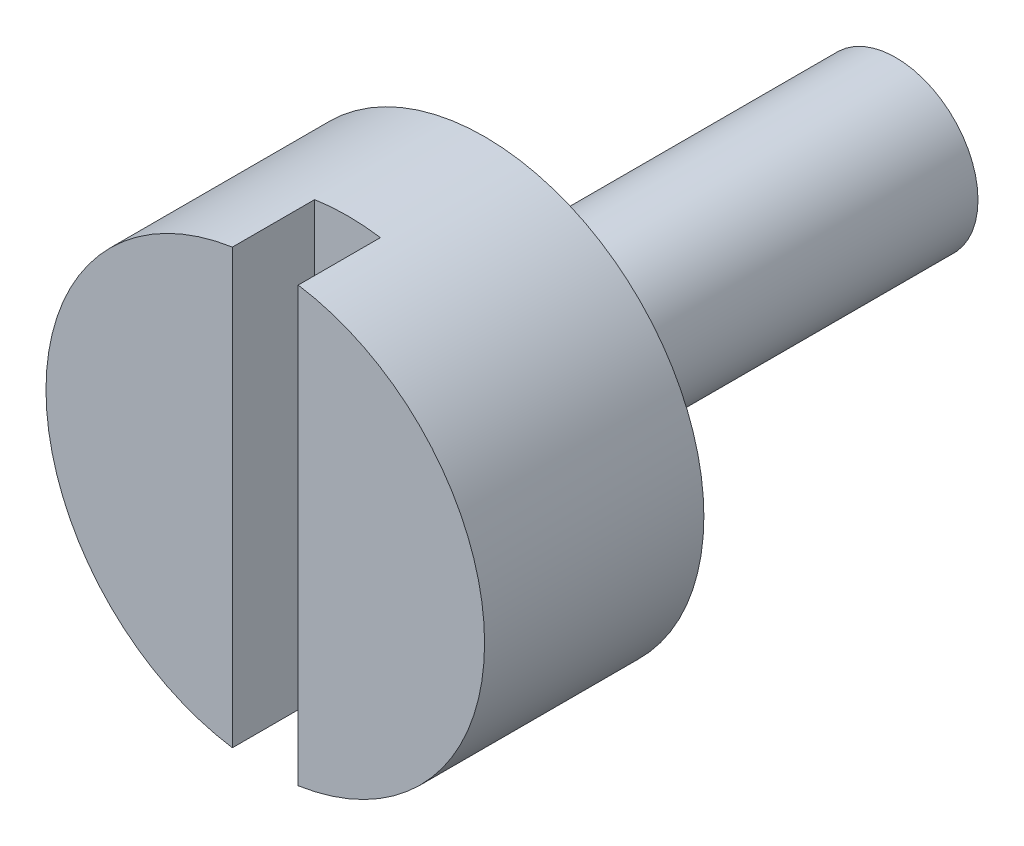
ISO-10303-21;
HEADER;
FILE_DESCRIPTION(('STEP AP214'),'2;1');
FILE_NAME('part.step','',(''),(''),'','','');
FILE_SCHEMA(('AUTOMOTIVE_DESIGN { 1 0 10303 214 1 1 1 1 }'));
ENDSEC;
DATA;
#1=APPLICATION_CONTEXT('core data for automotive mechanical design processes');
#2=APPLICATION_PROTOCOL_DEFINITION('international standard','automotive_design',2000,#1);
#3=PRODUCT_CONTEXT('',#1,'mechanical');
#4=PRODUCT('Part','Part','',(#3));
#5=PRODUCT_RELATED_PRODUCT_CATEGORY('part','',(#4));
#6=PRODUCT_DEFINITION_FORMATION('','',#4);
#7=PRODUCT_DEFINITION_CONTEXT('part definition',#1,'design');
#8=PRODUCT_DEFINITION('design','',#6,#7);
#9=PRODUCT_DEFINITION_SHAPE('','',#8);
#10=(LENGTH_UNIT() NAMED_UNIT(*) SI_UNIT(.MILLI.,.METRE.));
#11=(NAMED_UNIT(*) PLANE_ANGLE_UNIT() SI_UNIT($,.RADIAN.));
#12=(NAMED_UNIT(*) SI_UNIT($,.STERADIAN.) SOLID_ANGLE_UNIT());
#13=UNCERTAINTY_MEASURE_WITH_UNIT(LENGTH_MEASURE(1.E-05),#10,'distance_accuracy_value','');
#14=(GEOMETRIC_REPRESENTATION_CONTEXT(3) GLOBAL_UNCERTAINTY_ASSIGNED_CONTEXT((#13)) GLOBAL_UNIT_ASSIGNED_CONTEXT((#10,
#11,#12)) REPRESENTATION_CONTEXT('',''));
#15=CARTESIAN_POINT('',(0.,0.,0.));
#16=DIRECTION('',(0.,0.,1.));
#17=DIRECTION('',(1.,0.,0.));
#18=AXIS2_PLACEMENT_3D('',#15,#16,#17);
#19=CARTESIAN_POINT('',(-20.,0.,51.5));
#20=DIRECTION('',(0.,0.,-1.));
#21=DIRECTION('',(-1.,0.,0.));
#22=AXIS2_PLACEMENT_3D('',#19,#20,#21);
#23=CYLINDRICAL_SURFACE('',#22,4.);
#24=CARTESIAN_POINT('',(-20.,0.,47.5));
#25=DIRECTION('',(0.,0.,1.));
#26=DIRECTION('',(1.,0.,0.));
#27=AXIS2_PLACEMENT_3D('',#24,#25,#26);
#28=CIRCLE('',#27,4.);
#29=CARTESIAN_POINT('',(-16.,0.,47.5));
#30=VERTEX_POINT('',#29);
#31=EDGE_CURVE('E102',#30,#30,#28,.T.);
#32=ORIENTED_EDGE('',*,*,#31,.T.);
#33=EDGE_LOOP('',(#32));
#34=FACE_BOUND('',#33,.T.);
#35=DIRECTION('',(0.,0.,-1.));
#36=VECTOR('',#35,1.);
#37=CARTESIAN_POINT('',(-20.6,3.95474398665704,51.5));
#38=LINE('',#37,#36);
#39=CARTESIAN_POINT('',(-20.6,3.95474398665704,50.));
#40=VERTEX_POINT('',#39);
#41=CARTESIAN_POINT('',(-20.6,3.95474398665704,51.5));
#42=VERTEX_POINT('',#41);
#43=EDGE_CURVE('E61',#40,#42,#38,.F.);
#44=ORIENTED_EDGE('',*,*,#43,.F.);
#45=CARTESIAN_POINT('',(-20.,0.,50.));
#46=DIRECTION('',(0.,0.,1.));
#47=DIRECTION('',(1.,0.,0.));
#48=AXIS2_PLACEMENT_3D('',#45,#46,#47);
#49=CIRCLE('',#48,4.);
#50=CARTESIAN_POINT('',(-19.4,3.95474398665704,50.));
#51=VERTEX_POINT('',#50);
#52=EDGE_CURVE('E11',#51,#40,#49,.T.);
#53=ORIENTED_EDGE('',*,*,#52,.F.);
#54=DIRECTION('',(0.,0.,-1.));
#55=VECTOR('',#54,1.);
#56=CARTESIAN_POINT('',(-19.4,3.95474398665704,51.5));
#57=LINE('',#56,#55);
#58=CARTESIAN_POINT('',(-19.4,3.95474398665704,51.5));
#59=VERTEX_POINT('',#58);
#60=EDGE_CURVE('E90',#59,#51,#57,.T.);
#61=ORIENTED_EDGE('',*,*,#60,.F.);
#62=CARTESIAN_POINT('',(-20.,0.,51.5));
#63=DIRECTION('',(0.,0.,1.));
#64=DIRECTION('',(1.,0.,0.));
#65=AXIS2_PLACEMENT_3D('',#62,#63,#64);
#66=CIRCLE('',#65,4.);
#67=CARTESIAN_POINT('',(-19.4,-3.95474398665704,51.5));
#68=VERTEX_POINT('',#67);
#69=EDGE_CURVE('E94',#68,#59,#66,.T.);
#70=ORIENTED_EDGE('',*,*,#69,.F.);
#71=DIRECTION('',(0.,0.,-1.));
#72=VECTOR('',#71,1.);
#73=CARTESIAN_POINT('',(-19.4,-3.95474398665704,51.5));
#74=LINE('',#73,#72);
#75=CARTESIAN_POINT('',(-19.4,-3.95474398665704,50.));
#76=VERTEX_POINT('',#75);
#77=EDGE_CURVE('E53',#76,#68,#74,.F.);
#78=ORIENTED_EDGE('',*,*,#77,.F.);
#79=CARTESIAN_POINT('',(-20.6,-3.95474398665704,50.));
#80=VERTEX_POINT('',#79);
#81=EDGE_CURVE('E42',#80,#76,#49,.T.);
#82=ORIENTED_EDGE('',*,*,#81,.F.);
#83=DIRECTION('',(0.,0.,-1.));
#84=VECTOR('',#83,1.);
#85=CARTESIAN_POINT('',(-20.6,-3.95474398665704,51.5));
#86=LINE('',#85,#84);
#87=CARTESIAN_POINT('',(-20.6,-3.95474398665704,51.5));
#88=VERTEX_POINT('',#87);
#89=EDGE_CURVE('E100',#88,#80,#86,.T.);
#90=ORIENTED_EDGE('',*,*,#89,.F.);
#91=EDGE_CURVE('E104',#42,#88,#66,.T.);
#92=ORIENTED_EDGE('',*,*,#91,.F.);
#93=EDGE_LOOP('',(#44,#53,#61,#70,#78,#82,#90,#92));
#94=FACE_BOUND('',#93,.T.);
#95=ADVANCED_FACE('F38',(#34,#94),#23,.T.);
#96=CARTESIAN_POINT('',(-20.,0.,51.5));
#97=DIRECTION('',(0.,0.,1.));
#98=DIRECTION('',(1.,0.,0.));
#99=AXIS2_PLACEMENT_3D('',#96,#97,#98);
#100=PLANE('',#99);
#101=ORIENTED_EDGE('',*,*,#91,.T.);
#102=DIRECTION('',(0.,1.,0.));
#103=VECTOR('',#102,1.);
#104=CARTESIAN_POINT('',(-20.6,0.,51.5));
#105=LINE('',#104,#103);
#106=EDGE_CURVE('E87',#88,#42,#105,.T.);
#107=ORIENTED_EDGE('',*,*,#106,.T.);
#108=EDGE_LOOP('',(#101,#107));
#109=FACE_BOUND('',#108,.T.);
#110=ADVANCED_FACE('F117',(#109),#100,.T.);
#111=ORIENTED_EDGE('',*,*,#69,.T.);
#112=DIRECTION('',(0.,-1.,0.));
#113=VECTOR('',#112,1.);
#114=CARTESIAN_POINT('',(-19.4,0.,51.5));
#115=LINE('',#114,#113);
#116=EDGE_CURVE('E110',#59,#68,#115,.T.);
#117=ORIENTED_EDGE('',*,*,#116,.T.);
#118=EDGE_LOOP('',(#111,#117));
#119=FACE_BOUND('',#118,.T.);
#120=ADVANCED_FACE('F135',(#119),#100,.T.);
#121=CARTESIAN_POINT('',(-20.,0.,47.5));
#122=DIRECTION('',(0.,0.,-1.));
#123=DIRECTION('',(-1.,0.,0.));
#124=AXIS2_PLACEMENT_3D('',#121,#122,#123);
#125=CYLINDRICAL_SURFACE('',#124,1.5);
#126=CARTESIAN_POINT('',(-20.,0.,47.5));
#127=DIRECTION('',(0.,0.,1.));
#128=DIRECTION('',(1.,0.,0.));
#129=AXIS2_PLACEMENT_3D('',#126,#127,#128);
#130=CIRCLE('',#129,1.5);
#131=CARTESIAN_POINT('',(-18.5,0.,47.5));
#132=VERTEX_POINT('',#131);
#133=EDGE_CURVE('E107',#132,#132,#130,.T.);
#134=ORIENTED_EDGE('',*,*,#133,.F.);
#135=EDGE_LOOP('',(#134));
#136=FACE_BOUND('',#135,.T.);
#137=CARTESIAN_POINT('',(-20.,0.,40.));
#138=DIRECTION('',(0.,0.,1.));
#139=DIRECTION('',(1.,0.,0.));
#140=AXIS2_PLACEMENT_3D('',#137,#138,#139);
#141=CIRCLE('',#140,1.5);
#142=CARTESIAN_POINT('',(-18.5,0.,40.));
#143=VERTEX_POINT('',#142);
#144=EDGE_CURVE('E111',#143,#143,#141,.T.);
#145=ORIENTED_EDGE('',*,*,#144,.T.);
#146=EDGE_LOOP('',(#145));
#147=FACE_BOUND('',#146,.T.);
#148=ADVANCED_FACE('F40',(#136,#147),#125,.T.);
#149=CARTESIAN_POINT('',(-20.,0.,40.));
#150=DIRECTION('',(0.,0.,1.));
#151=DIRECTION('',(1.,0.,0.));
#152=AXIS2_PLACEMENT_3D('',#149,#150,#151);
#153=PLANE('',#152);
#154=ORIENTED_EDGE('',*,*,#144,.F.);
#155=EDGE_LOOP('',(#154));
#156=FACE_BOUND('',#155,.T.);
#157=ADVANCED_FACE('F137',(#156),#153,.F.);
#158=CARTESIAN_POINT('',(-20.,0.,47.5));
#159=DIRECTION('',(0.,0.,1.));
#160=DIRECTION('',(1.,0.,0.));
#161=AXIS2_PLACEMENT_3D('',#158,#159,#160);
#162=PLANE('',#161);
#163=ORIENTED_EDGE('',*,*,#133,.T.);
#164=EDGE_LOOP('',(#163));
#165=FACE_BOUND('',#164,.T.);
#166=ORIENTED_EDGE('',*,*,#31,.F.);
#167=EDGE_LOOP('',(#166));
#168=FACE_BOUND('',#167,.T.);
#169=ADVANCED_FACE('F126',(#165,#168),#162,.F.);
#170=CARTESIAN_POINT('',(0.,0.,50.));
#171=DIRECTION('',(0.,0.,1.));
#172=DIRECTION('',(1.,0.,0.));
#173=AXIS2_PLACEMENT_3D('',#170,#171,#172);
#174=PLANE('',#173);
#175=ORIENTED_EDGE('',*,*,#52,.T.);
#176=DIRECTION('',(0.,-1.,0.));
#177=VECTOR('',#176,1.);
#178=CARTESIAN_POINT('',(-20.6,5.,50.));
#179=LINE('',#178,#177);
#180=EDGE_CURVE('E84',#40,#80,#179,.T.);
#181=ORIENTED_EDGE('',*,*,#180,.T.);
#182=ORIENTED_EDGE('',*,*,#81,.T.);
#183=DIRECTION('',(0.,1.,0.));
#184=VECTOR('',#183,1.);
#185=CARTESIAN_POINT('',(-19.4,-5.,50.));
#186=LINE('',#185,#184);
#187=EDGE_CURVE('E82',#76,#51,#186,.T.);
#188=ORIENTED_EDGE('',*,*,#187,.T.);
#189=EDGE_LOOP('',(#175,#181,#182,#188));
#190=FACE_BOUND('',#189,.T.);
#191=ADVANCED_FACE('F81',(#190),#174,.T.);
#192=CARTESIAN_POINT('',(-20.6,5.,53.));
#193=DIRECTION('',(1.,0.,0.));
#194=DIRECTION('',(0.,0.,-1.));
#195=AXIS2_PLACEMENT_3D('',#192,#193,#194);
#196=PLANE('',#195);
#197=ORIENTED_EDGE('',*,*,#89,.T.);
#198=ORIENTED_EDGE('',*,*,#180,.F.);
#199=ORIENTED_EDGE('',*,*,#43,.T.);
#200=ORIENTED_EDGE('',*,*,#106,.F.);
#201=EDGE_LOOP('',(#197,#198,#199,#200));
#202=FACE_BOUND('',#201,.T.);
#203=ADVANCED_FACE('F118',(#202),#196,.T.);
#204=CARTESIAN_POINT('',(-19.4,-5.,53.));
#205=DIRECTION('',(-1.,0.,0.));
#206=DIRECTION('',(0.,0.,1.));
#207=AXIS2_PLACEMENT_3D('',#204,#205,#206);
#208=PLANE('',#207);
#209=ORIENTED_EDGE('',*,*,#60,.T.);
#210=ORIENTED_EDGE('',*,*,#187,.F.);
#211=ORIENTED_EDGE('',*,*,#77,.T.);
#212=ORIENTED_EDGE('',*,*,#116,.F.);
#213=EDGE_LOOP('',(#209,#210,#211,#212));
#214=FACE_BOUND('',#213,.T.);
#215=ADVANCED_FACE('F88',(#214),#208,.T.);
#216=CLOSED_SHELL('',(#95,#110,#120,#148,#157,#169,#191,#203,#215));
#217=MANIFOLD_SOLID_BREP('B2',#216);
#218=ADVANCED_BREP_SHAPE_REPRESENTATION('',(#18,#217),#14);
#219=SHAPE_DEFINITION_REPRESENTATION(#9,#218);
ENDSEC;
END-ISO-10303-21;
